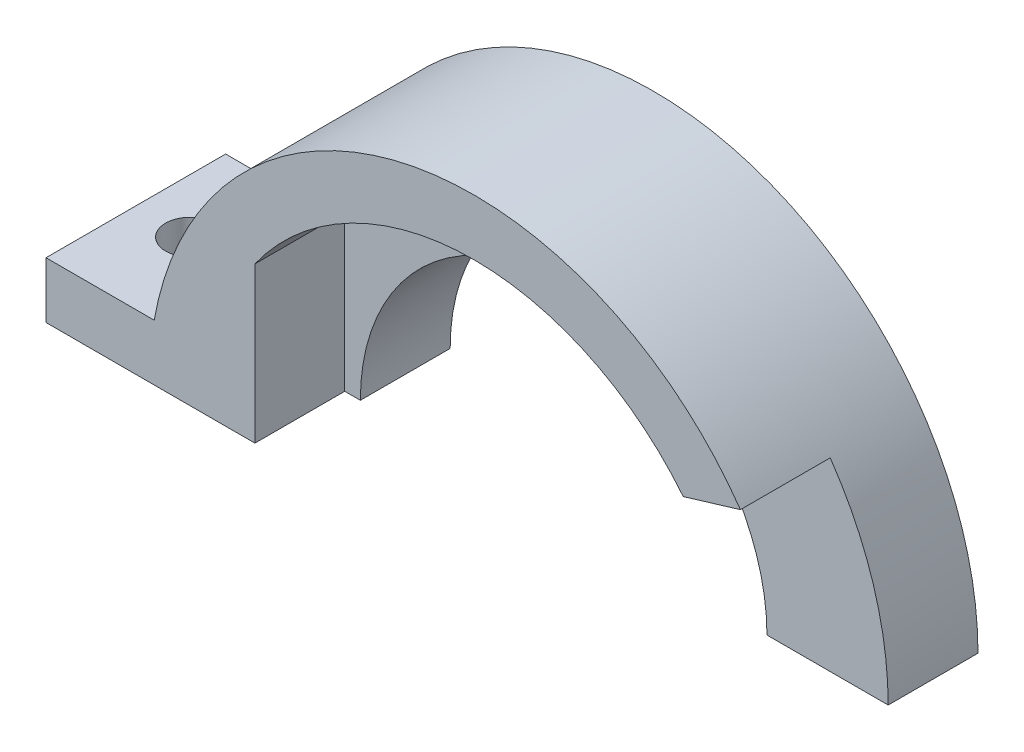
ISO-10303-21;
HEADER;
FILE_DESCRIPTION(('STEP AP214'),'2;1');
FILE_NAME('part.step','',(''),(''),'','','');
FILE_SCHEMA(('AUTOMOTIVE_DESIGN { 1 0 10303 214 1 1 1 1 }'));
ENDSEC;
DATA;
#1=APPLICATION_CONTEXT('core data for automotive mechanical design processes');
#2=APPLICATION_PROTOCOL_DEFINITION('international standard','automotive_design',2000,#1);
#3=PRODUCT_CONTEXT('',#1,'mechanical');
#4=PRODUCT('Part','Part','',(#3));
#5=PRODUCT_RELATED_PRODUCT_CATEGORY('part','',(#4));
#6=PRODUCT_DEFINITION_FORMATION('','',#4);
#7=PRODUCT_DEFINITION_CONTEXT('part definition',#1,'design');
#8=PRODUCT_DEFINITION('design','',#6,#7);
#9=PRODUCT_DEFINITION_SHAPE('','',#8);
#10=(LENGTH_UNIT() NAMED_UNIT(*) SI_UNIT(.MILLI.,.METRE.));
#11=(NAMED_UNIT(*) PLANE_ANGLE_UNIT() SI_UNIT($,.RADIAN.));
#12=(NAMED_UNIT(*) SI_UNIT($,.STERADIAN.) SOLID_ANGLE_UNIT());
#13=UNCERTAINTY_MEASURE_WITH_UNIT(LENGTH_MEASURE(1.E-05),#10,'distance_accuracy_value','');
#14=(GEOMETRIC_REPRESENTATION_CONTEXT(3) GLOBAL_UNCERTAINTY_ASSIGNED_CONTEXT((#13)) GLOBAL_UNIT_ASSIGNED_CONTEXT((#10,
#11,#12)) REPRESENTATION_CONTEXT('',''));
#15=CARTESIAN_POINT('',(0.,0.,0.));
#16=DIRECTION('',(0.,0.,1.));
#17=DIRECTION('',(1.,0.,0.));
#18=AXIS2_PLACEMENT_3D('',#15,#16,#17);
#19=CARTESIAN_POINT('',(0.,0.,8.));
#20=DIRECTION('',(0.,0.,-1.));
#21=DIRECTION('',(-1.,0.,0.));
#22=AXIS2_PLACEMENT_3D('',#19,#20,#21);
#23=CYLINDRICAL_SURFACE('',#22,28.9068116);
#24=CARTESIAN_POINT('',(0.,0.,-8.));
#25=DIRECTION('',(0.,0.,-1.));
#26=DIRECTION('',(-1.,0.,0.));
#27=AXIS2_PLACEMENT_3D('',#24,#25,#26);
#28=CIRCLE('',#27,28.9068116);
#29=CARTESIAN_POINT('',(-28.4711038928577,5.,-8.));
#30=VERTEX_POINT('',#29);
#31=CARTESIAN_POINT('',(28.9068116,0.,-8.));
#32=VERTEX_POINT('',#31);
#33=EDGE_CURVE('E165',#30,#32,#28,.T.);
#34=ORIENTED_EDGE('',*,*,#33,.F.);
#35=DIRECTION('',(0.,0.,-1.));
#36=VECTOR('',#35,1.);
#37=CARTESIAN_POINT('',(-28.4711038928577,5.,8.));
#38=LINE('',#37,#36);
#39=CARTESIAN_POINT('',(-28.4711038928577,5.,8.));
#40=VERTEX_POINT('',#39);
#41=EDGE_CURVE('E134',#40,#30,#38,.T.);
#42=ORIENTED_EDGE('',*,*,#41,.F.);
#43=CARTESIAN_POINT('',(0.,0.,8.));
#44=DIRECTION('',(0.,0.,1.));
#45=DIRECTION('',(1.,0.,0.));
#46=AXIS2_PLACEMENT_3D('',#43,#44,#45);
#47=CIRCLE('',#46,28.9068116);
#48=CARTESIAN_POINT('',(23.7423122931033,16.4895834954874,8.));
#49=VERTEX_POINT('',#48);
#50=EDGE_CURVE('E141',#49,#40,#47,.T.);
#51=ORIENTED_EDGE('',*,*,#50,.F.);
#52=DIRECTION('',(0.,0.,-1.));
#53=VECTOR('',#52,1.);
#54=CARTESIAN_POINT('',(23.7423122931033,16.4895834954874,8.));
#55=LINE('',#54,#53);
#56=CARTESIAN_POINT('',(23.7423122931033,16.4895834954874,0.));
#57=VERTEX_POINT('',#56);
#58=EDGE_CURVE('E82',#49,#57,#55,.T.);
#59=ORIENTED_EDGE('',*,*,#58,.T.);
#60=CARTESIAN_POINT('',(0.,0.,0.));
#61=DIRECTION('',(0.,0.,-1.));
#62=DIRECTION('',(-1.,0.,0.));
#63=AXIS2_PLACEMENT_3D('',#60,#61,#62);
#64=CIRCLE('',#63,28.9068116);
#65=CARTESIAN_POINT('',(28.9068116,0.,0.));
#66=VERTEX_POINT('',#65);
#67=EDGE_CURVE('E162',#57,#66,#64,.T.);
#68=ORIENTED_EDGE('',*,*,#67,.T.);
#69=DIRECTION('',(0.,0.,1.));
#70=VECTOR('',#69,1.);
#71=CARTESIAN_POINT('',(28.9068116,0.,-8.));
#72=LINE('',#71,#70);
#73=EDGE_CURVE('E197',#32,#66,#72,.T.);
#74=ORIENTED_EDGE('',*,*,#73,.F.);
#75=EDGE_LOOP('',(#34,#42,#51,#59,#68,#74));
#76=FACE_BOUND('',#75,.T.);
#77=ADVANCED_FACE('F39',(#76),#23,.T.);
#78=CARTESIAN_POINT('',(-28.9068116,0.,8.));
#79=DIRECTION('',(0.,1.,0.));
#80=DIRECTION('',(-1.,0.,0.));
#81=AXIS2_PLACEMENT_3D('',#78,#79,#80);
#82=PLANE('',#81);
#83=CARTESIAN_POINT('',(-33.2908319464288,0.,0.));
#84=DIRECTION('',(0.,1.,0.));
#85=DIRECTION('',(0.,0.,1.));
#86=AXIS2_PLACEMENT_3D('',#83,#84,#85);
#87=CIRCLE('',#86,2.165);
#88=CARTESIAN_POINT('',(-33.2908319464288,0.,2.165));
#89=VERTEX_POINT('',#88);
#90=EDGE_CURVE('E158',#89,#89,#87,.T.);
#91=ORIENTED_EDGE('',*,*,#90,.T.);
#92=EDGE_LOOP('',(#91));
#93=FACE_BOUND('',#92,.T.);
#94=DIRECTION('',(1.,0.,0.));
#95=VECTOR('',#94,1.);
#96=CARTESIAN_POINT('',(-28.9068116,0.,8.));
#97=LINE('',#96,#95);
#98=CARTESIAN_POINT('',(-38.11056,0.,8.));
#99=VERTEX_POINT('',#98);
#100=CARTESIAN_POINT('',(-19.5,0.,8.));
#101=VERTEX_POINT('',#100);
#102=EDGE_CURVE('E216',#99,#101,#97,.T.);
#103=ORIENTED_EDGE('',*,*,#102,.F.);
#104=DIRECTION('',(0.,0.,-1.));
#105=VECTOR('',#104,1.);
#106=CARTESIAN_POINT('',(-38.11056,0.,8.));
#107=LINE('',#106,#105);
#108=CARTESIAN_POINT('',(-38.11056,0.,-8.));
#109=VERTEX_POINT('',#108);
#110=EDGE_CURVE('E147',#99,#109,#107,.T.);
#111=ORIENTED_EDGE('',*,*,#110,.T.);
#112=DIRECTION('',(-1.,0.,0.));
#113=VECTOR('',#112,1.);
#114=CARTESIAN_POINT('',(-18.11056,0.,-8.));
#115=LINE('',#114,#113);
#116=CARTESIAN_POINT('',(-18.11056,0.,-8.));
#117=VERTEX_POINT('',#116);
#118=EDGE_CURVE('E175',#117,#109,#115,.T.);
#119=ORIENTED_EDGE('',*,*,#118,.F.);
#120=DIRECTION('',(0.,0.,1.));
#121=VECTOR('',#120,1.);
#122=CARTESIAN_POINT('',(-18.11056,0.,-8.));
#123=LINE('',#122,#121);
#124=CARTESIAN_POINT('',(-18.11056,0.,0.));
#125=VERTEX_POINT('',#124);
#126=EDGE_CURVE('E178',#117,#125,#123,.T.);
#127=ORIENTED_EDGE('',*,*,#126,.T.);
#128=DIRECTION('',(-1.,0.,0.));
#129=VECTOR('',#128,1.);
#130=CARTESIAN_POINT('',(-18.11056,0.,0.));
#131=LINE('',#130,#129);
#132=CARTESIAN_POINT('',(-19.5,0.,0.));
#133=VERTEX_POINT('',#132);
#134=EDGE_CURVE('E169',#125,#133,#131,.T.);
#135=ORIENTED_EDGE('',*,*,#134,.T.);
#136=DIRECTION('',(0.,0.,-1.));
#137=VECTOR('',#136,1.);
#138=CARTESIAN_POINT('',(-19.5,0.,8.));
#139=LINE('',#138,#137);
#140=EDGE_CURVE('E11',#101,#133,#139,.T.);
#141=ORIENTED_EDGE('',*,*,#140,.F.);
#142=EDGE_LOOP('',(#103,#111,#119,#127,#135,#141));
#143=FACE_BOUND('',#142,.T.);
#144=ADVANCED_FACE('F240',(#93,#143),#82,.F.);
#145=CARTESIAN_POINT('',(-19.5,13.8306052245697,8.));
#146=DIRECTION('',(-1.,0.,0.));
#147=DIRECTION('',(0.,0.,1.));
#148=AXIS2_PLACEMENT_3D('',#145,#146,#147);
#149=PLANE('',#148);
#150=DIRECTION('',(0.,1.,0.));
#151=VECTOR('',#150,1.);
#152=CARTESIAN_POINT('',(-19.5,13.8306052245697,0.));
#153=LINE('',#152,#151);
#154=CARTESIAN_POINT('',(-19.5,13.8306052245697,0.));
#155=VERTEX_POINT('',#154);
#156=EDGE_CURVE('E213',#133,#155,#153,.T.);
#157=ORIENTED_EDGE('',*,*,#156,.T.);
#158=DIRECTION('',(0.,0.,-1.));
#159=VECTOR('',#158,1.);
#160=CARTESIAN_POINT('',(-19.5,13.8306052245697,8.));
#161=LINE('',#160,#159);
#162=CARTESIAN_POINT('',(-19.5,13.8306052245697,8.));
#163=VERTEX_POINT('',#162);
#164=EDGE_CURVE('E47',#163,#155,#161,.T.);
#165=ORIENTED_EDGE('',*,*,#164,.F.);
#166=DIRECTION('',(0.,1.,0.));
#167=VECTOR('',#166,1.);
#168=CARTESIAN_POINT('',(-19.5,13.8306052245697,8.));
#169=LINE('',#168,#167);
#170=EDGE_CURVE('E63',#101,#163,#169,.T.);
#171=ORIENTED_EDGE('',*,*,#170,.F.);
#172=ORIENTED_EDGE('',*,*,#140,.T.);
#173=EDGE_LOOP('',(#157,#165,#171,#172));
#174=FACE_BOUND('',#173,.T.);
#175=ADVANCED_FACE('F234',(#174),#149,.F.);
#176=CARTESIAN_POINT('',(0.,0.,8.));
#177=DIRECTION('',(0.,0.,-1.));
#178=DIRECTION('',(-1.,0.,0.));
#179=AXIS2_PLACEMENT_3D('',#176,#177,#178);
#180=CYLINDRICAL_SURFACE('',#179,23.9068116);
#181=CARTESIAN_POINT('',(0.,0.,0.));
#182=DIRECTION('',(0.,0.,-1.));
#183=DIRECTION('',(1.,0.,0.));
#184=AXIS2_PLACEMENT_3D('',#181,#182,#183);
#185=CIRCLE('',#184,23.9068116);
#186=CARTESIAN_POINT('',(18.6509355323344,14.9558765923834,0.));
#187=VERTEX_POINT('',#186);
#188=EDGE_CURVE('E74',#155,#187,#185,.T.);
#189=ORIENTED_EDGE('',*,*,#188,.T.);
#190=DIRECTION('',(0.,0.,-1.));
#191=VECTOR('',#190,1.);
#192=CARTESIAN_POINT('',(18.6509355323344,14.9558765923834,8.));
#193=LINE('',#192,#191);
#194=CARTESIAN_POINT('',(18.6509355323344,14.9558765923834,8.));
#195=VERTEX_POINT('',#194);
#196=EDGE_CURVE('E205',#195,#187,#193,.T.);
#197=ORIENTED_EDGE('',*,*,#196,.F.);
#198=CARTESIAN_POINT('',(0.,0.,8.));
#199=DIRECTION('',(0.,0.,-1.));
#200=DIRECTION('',(1.,0.,0.));
#201=AXIS2_PLACEMENT_3D('',#198,#199,#200);
#202=CIRCLE('',#201,23.9068116);
#203=EDGE_CURVE('E221',#163,#195,#202,.T.);
#204=ORIENTED_EDGE('',*,*,#203,.F.);
#205=ORIENTED_EDGE('',*,*,#164,.T.);
#206=EDGE_LOOP('',(#189,#197,#204,#205));
#207=FACE_BOUND('',#206,.T.);
#208=ADVANCED_FACE('F231',(#207),#180,.F.);
#209=CARTESIAN_POINT('',(0.,0.,8.));
#210=DIRECTION('',(0.,0.,1.));
#211=DIRECTION('',(1.,0.,0.));
#212=AXIS2_PLACEMENT_3D('',#209,#210,#211);
#213=PLANE('',#212);
#214=DIRECTION('',(0.957499895701287,0.288433614081342,0.));
#215=VECTOR('',#214,1.);
#216=CARTESIAN_POINT('',(18.6509355323344,14.9558765923834,8.));
#217=LINE('',#216,#215);
#218=EDGE_CURVE('E202',#195,#49,#217,.T.);
#219=ORIENTED_EDGE('',*,*,#218,.T.);
#220=ORIENTED_EDGE('',*,*,#50,.T.);
#221=DIRECTION('',(1.,0.,0.));
#222=VECTOR('',#221,1.);
#223=CARTESIAN_POINT('',(-28.4711038928577,5.,8.));
#224=LINE('',#223,#222);
#225=CARTESIAN_POINT('',(-38.11056,5.,8.));
#226=VERTEX_POINT('',#225);
#227=EDGE_CURVE('E128',#226,#40,#224,.T.);
#228=ORIENTED_EDGE('',*,*,#227,.F.);
#229=DIRECTION('',(0.,1.,0.));
#230=VECTOR('',#229,1.);
#231=CARTESIAN_POINT('',(-38.11056,0.,8.));
#232=LINE('',#231,#230);
#233=EDGE_CURVE('E139',#99,#226,#232,.T.);
#234=ORIENTED_EDGE('',*,*,#233,.F.);
#235=ORIENTED_EDGE('',*,*,#102,.T.);
#236=ORIENTED_EDGE('',*,*,#170,.T.);
#237=ORIENTED_EDGE('',*,*,#203,.T.);
#238=EDGE_LOOP('',(#219,#220,#228,#234,#235,#236,#237));
#239=FACE_BOUND('',#238,.T.);
#240=ADVANCED_FACE('F138',(#239),#213,.T.);
#241=CARTESIAN_POINT('',(18.6509355323344,14.9558765923834,8.));
#242=DIRECTION('',(-0.288433614081342,0.957499895701287,0.));
#243=DIRECTION('',(-0.957499895701287,-0.288433614081342,0.));
#244=AXIS2_PLACEMENT_3D('',#241,#242,#243);
#245=PLANE('',#244);
#246=ORIENTED_EDGE('',*,*,#218,.F.);
#247=ORIENTED_EDGE('',*,*,#196,.T.);
#248=DIRECTION('',(0.957499895701287,0.288433614081342,0.));
#249=VECTOR('',#248,1.);
#250=CARTESIAN_POINT('',(18.6509355323344,14.9558765923834,0.));
#251=LINE('',#250,#249);
#252=EDGE_CURVE('E201',#187,#57,#251,.T.);
#253=ORIENTED_EDGE('',*,*,#252,.T.);
#254=ORIENTED_EDGE('',*,*,#58,.F.);
#255=EDGE_LOOP('',(#246,#247,#253,#254));
#256=FACE_BOUND('',#255,.T.);
#257=ADVANCED_FACE('F279',(#256),#245,.F.);
#258=CARTESIAN_POINT('',(28.9068116,0.,-8.));
#259=DIRECTION('',(0.,1.,0.));
#260=DIRECTION('',(0.,0.,1.));
#261=AXIS2_PLACEMENT_3D('',#258,#259,#260);
#262=PLANE('',#261);
#263=DIRECTION('',(-1.,0.,0.));
#264=VECTOR('',#263,1.);
#265=CARTESIAN_POINT('',(28.9068116,0.,0.));
#266=LINE('',#265,#264);
#267=CARTESIAN_POINT('',(18.11056,0.,0.));
#268=VERTEX_POINT('',#267);
#269=EDGE_CURVE('E181',#66,#268,#266,.T.);
#270=ORIENTED_EDGE('',*,*,#269,.T.);
#271=DIRECTION('',(0.,0.,1.));
#272=VECTOR('',#271,1.);
#273=CARTESIAN_POINT('',(18.11056,0.,-8.));
#274=LINE('',#273,#272);
#275=CARTESIAN_POINT('',(18.11056,0.,-8.));
#276=VERTEX_POINT('',#275);
#277=EDGE_CURVE('E193',#276,#268,#274,.T.);
#278=ORIENTED_EDGE('',*,*,#277,.F.);
#279=DIRECTION('',(-1.,0.,0.));
#280=VECTOR('',#279,1.);
#281=CARTESIAN_POINT('',(28.9068116,0.,-8.));
#282=LINE('',#281,#280);
#283=EDGE_CURVE('E168',#32,#276,#282,.T.);
#284=ORIENTED_EDGE('',*,*,#283,.F.);
#285=ORIENTED_EDGE('',*,*,#73,.T.);
#286=EDGE_LOOP('',(#270,#278,#284,#285));
#287=FACE_BOUND('',#286,.T.);
#288=ADVANCED_FACE('F251',(#287),#262,.F.);
#289=CARTESIAN_POINT('',(0.,0.,-8.));
#290=DIRECTION('',(0.,0.,1.));
#291=DIRECTION('',(1.,0.,0.));
#292=AXIS2_PLACEMENT_3D('',#289,#290,#291);
#293=CYLINDRICAL_SURFACE('',#292,18.11056);
#294=CARTESIAN_POINT('',(0.,0.,0.));
#295=DIRECTION('',(0.,0.,1.));
#296=DIRECTION('',(-1.,0.,0.));
#297=AXIS2_PLACEMENT_3D('',#294,#295,#296);
#298=CIRCLE('',#297,18.11056);
#299=EDGE_CURVE('E184',#268,#125,#298,.T.);
#300=ORIENTED_EDGE('',*,*,#299,.T.);
#301=ORIENTED_EDGE('',*,*,#126,.F.);
#302=CARTESIAN_POINT('',(0.,0.,-8.));
#303=DIRECTION('',(0.,0.,1.));
#304=DIRECTION('',(-1.,0.,0.));
#305=AXIS2_PLACEMENT_3D('',#302,#303,#304);
#306=CIRCLE('',#305,18.11056);
#307=EDGE_CURVE('E172',#276,#117,#306,.T.);
#308=ORIENTED_EDGE('',*,*,#307,.F.);
#309=ORIENTED_EDGE('',*,*,#277,.T.);
#310=EDGE_LOOP('',(#300,#301,#308,#309));
#311=FACE_BOUND('',#310,.T.);
#312=ADVANCED_FACE('F245',(#311),#293,.F.);
#313=CARTESIAN_POINT('',(0.,0.,-8.));
#314=DIRECTION('',(0.,0.,-1.));
#315=DIRECTION('',(-1.,0.,0.));
#316=AXIS2_PLACEMENT_3D('',#313,#314,#315);
#317=PLANE('',#316);
#318=ORIENTED_EDGE('',*,*,#118,.T.);
#319=DIRECTION('',(0.,1.,0.));
#320=VECTOR('',#319,1.);
#321=CARTESIAN_POINT('',(-38.11056,0.,-8.));
#322=LINE('',#321,#320);
#323=CARTESIAN_POINT('',(-38.11056,5.,-8.));
#324=VERTEX_POINT('',#323);
#325=EDGE_CURVE('E151',#109,#324,#322,.T.);
#326=ORIENTED_EDGE('',*,*,#325,.T.);
#327=DIRECTION('',(1.,0.,0.));
#328=VECTOR('',#327,1.);
#329=CARTESIAN_POINT('',(-28.4711038928577,5.,-8.));
#330=LINE('',#329,#328);
#331=EDGE_CURVE('E54',#324,#30,#330,.T.);
#332=ORIENTED_EDGE('',*,*,#331,.T.);
#333=ORIENTED_EDGE('',*,*,#33,.T.);
#334=ORIENTED_EDGE('',*,*,#283,.T.);
#335=ORIENTED_EDGE('',*,*,#307,.T.);
#336=EDGE_LOOP('',(#318,#326,#332,#333,#334,#335));
#337=FACE_BOUND('',#336,.T.);
#338=ADVANCED_FACE('F254',(#337),#317,.T.);
#339=CARTESIAN_POINT('',(0.,0.,0.));
#340=DIRECTION('',(0.,0.,-1.));
#341=DIRECTION('',(-1.,0.,0.));
#342=AXIS2_PLACEMENT_3D('',#339,#340,#341);
#343=PLANE('',#342);
#344=ORIENTED_EDGE('',*,*,#252,.F.);
#345=ORIENTED_EDGE('',*,*,#188,.F.);
#346=ORIENTED_EDGE('',*,*,#156,.F.);
#347=ORIENTED_EDGE('',*,*,#134,.F.);
#348=ORIENTED_EDGE('',*,*,#299,.F.);
#349=ORIENTED_EDGE('',*,*,#269,.F.);
#350=ORIENTED_EDGE('',*,*,#67,.F.);
#351=EDGE_LOOP('',(#344,#345,#346,#347,#348,#349,#350));
#352=FACE_BOUND('',#351,.T.);
#353=ADVANCED_FACE('F237',(#352),#343,.F.);
#354=CARTESIAN_POINT('',(-38.11056,0.,8.));
#355=DIRECTION('',(-1.,0.,0.));
#356=DIRECTION('',(0.,0.,1.));
#357=AXIS2_PLACEMENT_3D('',#354,#355,#356);
#358=PLANE('',#357);
#359=ORIENTED_EDGE('',*,*,#325,.F.);
#360=ORIENTED_EDGE('',*,*,#110,.F.);
#361=ORIENTED_EDGE('',*,*,#233,.T.);
#362=DIRECTION('',(0.,0.,-1.));
#363=VECTOR('',#362,1.);
#364=CARTESIAN_POINT('',(-38.11056,5.,8.));
#365=LINE('',#364,#363);
#366=EDGE_CURVE('E125',#226,#324,#365,.T.);
#367=ORIENTED_EDGE('',*,*,#366,.T.);
#368=EDGE_LOOP('',(#359,#360,#361,#367));
#369=FACE_BOUND('',#368,.T.);
#370=ADVANCED_FACE('F145',(#369),#358,.T.);
#371=CARTESIAN_POINT('',(-28.4711038928577,5.,8.));
#372=DIRECTION('',(0.,1.,0.));
#373=DIRECTION('',(0.,0.,1.));
#374=AXIS2_PLACEMENT_3D('',#371,#372,#373);
#375=PLANE('',#374);
#376=CARTESIAN_POINT('',(-33.2908319464288,5.,0.));
#377=DIRECTION('',(0.,1.,0.));
#378=DIRECTION('',(0.,0.,1.));
#379=AXIS2_PLACEMENT_3D('',#376,#377,#378);
#380=CIRCLE('',#379,2.165);
#381=CARTESIAN_POINT('',(-33.2908319464288,5.,2.165));
#382=VERTEX_POINT('',#381);
#383=EDGE_CURVE('E154',#382,#382,#380,.T.);
#384=ORIENTED_EDGE('',*,*,#383,.F.);
#385=EDGE_LOOP('',(#384));
#386=FACE_BOUND('',#385,.T.);
#387=ORIENTED_EDGE('',*,*,#331,.F.);
#388=ORIENTED_EDGE('',*,*,#366,.F.);
#389=ORIENTED_EDGE('',*,*,#227,.T.);
#390=ORIENTED_EDGE('',*,*,#41,.T.);
#391=EDGE_LOOP('',(#387,#388,#389,#390));
#392=FACE_BOUND('',#391,.T.);
#393=ADVANCED_FACE('F127',(#386,#392),#375,.T.);
#394=CARTESIAN_POINT('',(-33.2908319464288,0.,0.));
#395=DIRECTION('',(0.,1.,0.));
#396=DIRECTION('',(0.,0.,1.));
#397=AXIS2_PLACEMENT_3D('',#394,#395,#396);
#398=CYLINDRICAL_SURFACE('',#397,2.165);
#399=ORIENTED_EDGE('',*,*,#90,.F.);
#400=EDGE_LOOP('',(#399));
#401=FACE_BOUND('',#400,.T.);
#402=ORIENTED_EDGE('',*,*,#383,.T.);
#403=EDGE_LOOP('',(#402));
#404=FACE_BOUND('',#403,.T.);
#405=ADVANCED_FACE('F336',(#401,#404),#398,.F.);
#406=CLOSED_SHELL('',(#77,#144,#175,#208,#240,#257,#288,#312,#338,#353,#370,#393,#405));
#407=MANIFOLD_SOLID_BREP('B2',#406);
#408=ADVANCED_BREP_SHAPE_REPRESENTATION('',(#18,#407),#14);
#409=SHAPE_DEFINITION_REPRESENTATION(#9,#408);
ENDSEC;
END-ISO-10303-21;
